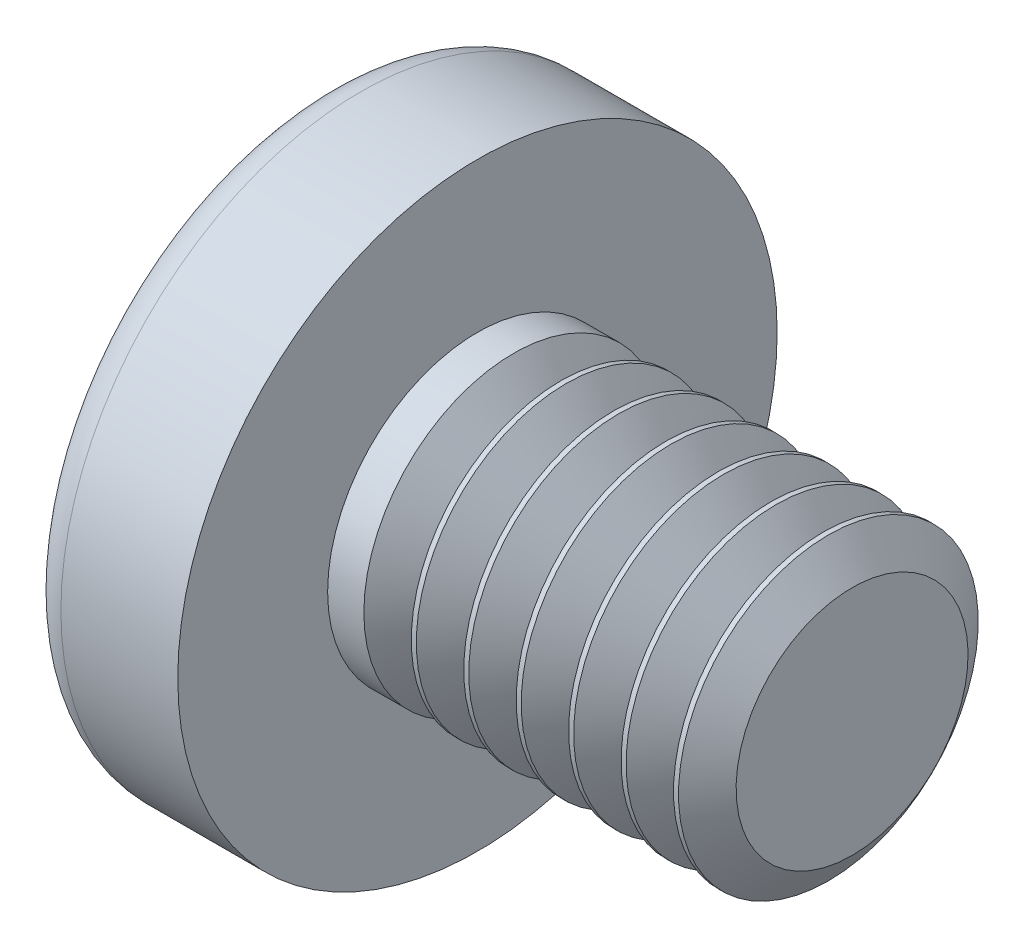
ISO-10303-21;
HEADER;
FILE_DESCRIPTION(('STEP AP214'),'2;1');
FILE_NAME('part.step','',(''),(''),'','','');
FILE_SCHEMA(('AUTOMOTIVE_DESIGN { 1 0 10303 214 1 1 1 1 }'));
ENDSEC;
DATA;
#1=APPLICATION_CONTEXT('core data for automotive mechanical design processes');
#2=APPLICATION_PROTOCOL_DEFINITION('international standard','automotive_design',2000,#1);
#3=PRODUCT_CONTEXT('',#1,'mechanical');
#4=PRODUCT('Part','Part','',(#3));
#5=PRODUCT_RELATED_PRODUCT_CATEGORY('part','',(#4));
#6=PRODUCT_DEFINITION_FORMATION('','',#4);
#7=PRODUCT_DEFINITION_CONTEXT('part definition',#1,'design');
#8=PRODUCT_DEFINITION('design','',#6,#7);
#9=PRODUCT_DEFINITION_SHAPE('','',#8);
#10=(LENGTH_UNIT() NAMED_UNIT(*) SI_UNIT(.MILLI.,.METRE.));
#11=(NAMED_UNIT(*) PLANE_ANGLE_UNIT() SI_UNIT($,.RADIAN.));
#12=(NAMED_UNIT(*) SI_UNIT($,.STERADIAN.) SOLID_ANGLE_UNIT());
#13=UNCERTAINTY_MEASURE_WITH_UNIT(LENGTH_MEASURE(1.E-05),#10,'distance_accuracy_value','');
#14=(GEOMETRIC_REPRESENTATION_CONTEXT(3) GLOBAL_UNCERTAINTY_ASSIGNED_CONTEXT((#13)) GLOBAL_UNIT_ASSIGNED_CONTEXT((#10,
#11,#12)) REPRESENTATION_CONTEXT('',''));
#15=CARTESIAN_POINT('',(0.,0.,0.));
#16=DIRECTION('',(0.,0.,1.));
#17=DIRECTION('',(1.,0.,0.));
#18=AXIS2_PLACEMENT_3D('',#15,#16,#17);
#19=CARTESIAN_POINT('',(3.2,0.,0.));
#20=DIRECTION('',(-1.,0.,0.));
#21=DIRECTION('',(0.,1.,0.));
#22=AXIS2_PLACEMENT_3D('',#19,#20,#21);
#23=SPHERICAL_SURFACE('',#22,3.2);
#24=CARTESIAN_POINT('',(0.627117875780583,0.,0.));
#25=DIRECTION('',(-1.,0.,0.));
#26=DIRECTION('',(0.,0.,1.));
#27=AXIS2_PLACEMENT_3D('',#24,#25,#26);
#28=CIRCLE('',#27,1.9027027027027);
#29=CARTESIAN_POINT('',(0.627117875780583,0.,1.9027027027027));
#30=VERTEX_POINT('',#29);
#31=EDGE_CURVE('E151',#30,#30,#28,.T.);
#32=ORIENTED_EDGE('',*,*,#31,.T.);
#33=EDGE_LOOP('',(#32));
#34=FACE_BOUND('',#33,.T.);
#35=CARTESIAN_POINT('',(3.19174554351625,-0.0818566934638239,0.));
#36=DIRECTION('',(-0.100331502261418,-0.994954064092392,0.));
#37=DIRECTION('',(0.994954064092392,-0.100331502261418,0.));
#38=AXIS2_PLACEMENT_3D('',#35,#36,#37);
#39=CIRCLE('',#38,3.1989422229361);
#40=CARTESIAN_POINT('',(0.118330716626357,0.228067490760364,0.831444314172419));
#41=VERTEX_POINT('',#40);
#42=CARTESIAN_POINT('',(0.0177814447975952,0.238206913129653,0.238206913129654));
#43=VERTEX_POINT('',#42);
#44=EDGE_CURVE('E182',#41,#43,#39,.T.);
#45=ORIENTED_EDGE('',*,*,#44,.F.);
#46=CARTESIAN_POINT('',(2.64043280070581,0.,-0.842892363493775));
#47=DIRECTION('',(0.553083521918191,0.,0.833125811497021));
#48=DIRECTION('',(0.833125811497021,0.,-0.553083521918191));
#49=AXIS2_PLACEMENT_3D('',#46,#47,#48);
#50=CIRCLE('',#49,3.03585523585001);
#51=CARTESIAN_POINT('',(0.118330716626355,-0.22806749076037,0.831444314172418));
#52=VERTEX_POINT('',#51);
#53=EDGE_CURVE('E150',#41,#52,#50,.T.);
#54=ORIENTED_EDGE('',*,*,#53,.T.);
#55=CARTESIAN_POINT('',(3.19174554351625,0.081856693463823,0.));
#56=DIRECTION('',(-0.100331502261417,0.994954064092392,0.));
#57=DIRECTION('',(-0.994954064092392,-0.100331502261417,0.));
#58=AXIS2_PLACEMENT_3D('',#55,#56,#57);
#59=CIRCLE('',#58,3.1989422229361);
#60=CARTESIAN_POINT('',(0.0177814447975943,-0.238206913129655,0.238206913129654));
#61=VERTEX_POINT('',#60);
#62=EDGE_CURVE('E106',#61,#52,#59,.T.);
#63=ORIENTED_EDGE('',*,*,#62,.F.);
#64=CARTESIAN_POINT('',(3.19174554351625,0.,-0.081856693463823));
#65=DIRECTION('',(-0.100331502261417,0.,-0.994954064092392));
#66=DIRECTION('',(-0.994954064092392,0.,0.100331502261417));
#67=AXIS2_PLACEMENT_3D('',#64,#65,#66);
#68=CIRCLE('',#67,3.1989422229361);
#69=CARTESIAN_POINT('',(0.118330716626355,-0.831444314172419,0.228067490760367));
#70=VERTEX_POINT('',#69);
#71=EDGE_CURVE('E131',#70,#61,#68,.T.);
#72=ORIENTED_EDGE('',*,*,#71,.F.);
#73=CARTESIAN_POINT('',(2.64043280070581,0.842892363493772,0.));
#74=DIRECTION('',(0.55308352191819,-0.833125811497022,0.));
#75=DIRECTION('',(0.833125811497022,0.55308352191819,0.));
#76=AXIS2_PLACEMENT_3D('',#73,#74,#75);
#77=CIRCLE('',#76,3.03585523585001);
#78=CARTESIAN_POINT('',(0.118330716626355,-0.831444314172419,-0.228067490760368));
#79=VERTEX_POINT('',#78);
#80=EDGE_CURVE('E139',#70,#79,#77,.T.);
#81=ORIENTED_EDGE('',*,*,#80,.T.);
#82=CARTESIAN_POINT('',(3.19174554351625,0.,0.0818566934638239));
#83=DIRECTION('',(-0.100331502261418,0.,0.994954064092392));
#84=DIRECTION('',(0.994954064092392,0.,0.100331502261418));
#85=AXIS2_PLACEMENT_3D('',#82,#83,#84);
#86=CIRCLE('',#85,3.1989422229361);
#87=CARTESIAN_POINT('',(0.0177814447975943,-0.238206913129653,-0.238206913129654));
#88=VERTEX_POINT('',#87);
#89=EDGE_CURVE('E49',#88,#79,#86,.T.);
#90=ORIENTED_EDGE('',*,*,#89,.F.);
#91=CARTESIAN_POINT('',(0.118330716626356,-0.228067490760364,-0.831444314172419));
#92=VERTEX_POINT('',#91);
#93=EDGE_CURVE('E189',#92,#88,#59,.T.);
#94=ORIENTED_EDGE('',*,*,#93,.F.);
#95=CARTESIAN_POINT('',(2.64043280070581,0.,0.842892363493774));
#96=DIRECTION('',(0.55308352191819,0.,-0.833125811497022));
#97=DIRECTION('',(-0.833125811497022,0.,-0.55308352191819));
#98=AXIS2_PLACEMENT_3D('',#95,#96,#97);
#99=CIRCLE('',#98,3.03585523585001);
#100=CARTESIAN_POINT('',(0.118330716626357,0.22806749076037,-0.831444314172417));
#101=VERTEX_POINT('',#100);
#102=EDGE_CURVE('E132',#92,#101,#99,.T.);
#103=ORIENTED_EDGE('',*,*,#102,.T.);
#104=CARTESIAN_POINT('',(0.0177814447975956,0.238206913129655,-0.238206913129654));
#105=VERTEX_POINT('',#104);
#106=EDGE_CURVE('E177',#105,#101,#39,.T.);
#107=ORIENTED_EDGE('',*,*,#106,.F.);
#108=CARTESIAN_POINT('',(0.118330716626357,0.831444314172418,-0.228067490760367));
#109=VERTEX_POINT('',#108);
#110=EDGE_CURVE('E42',#109,#105,#86,.T.);
#111=ORIENTED_EDGE('',*,*,#110,.F.);
#112=CARTESIAN_POINT('',(2.64043280070582,-0.842892363493777,0.));
#113=DIRECTION('',(0.553083521918191,0.833125811497021,0.));
#114=DIRECTION('',(-0.833125811497021,0.553083521918191,0.));
#115=AXIS2_PLACEMENT_3D('',#112,#113,#114);
#116=CIRCLE('',#115,3.03585523585001);
#117=CARTESIAN_POINT('',(0.118330716626358,0.831444314172418,0.228067490760367));
#118=VERTEX_POINT('',#117);
#119=EDGE_CURVE('E11',#109,#118,#116,.T.);
#120=ORIENTED_EDGE('',*,*,#119,.T.);
#121=EDGE_CURVE('E165',#43,#118,#68,.T.);
#122=ORIENTED_EDGE('',*,*,#121,.F.);
#123=EDGE_LOOP('',(#45,#54,#63,#72,#81,#90,#94,#103,#107,#111,#120,#122));
#124=FACE_BOUND('',#123,.T.);
#125=ADVANCED_FACE('F34',(#34,#124),#23,.T.);
#126=CARTESIAN_POINT('',(1.37075949367089,0.,-0.101772151898734));
#127=DIRECTION('',(-0.100331502261418,0.,0.994954064092392));
#128=DIRECTION('',(0.994954064092392,0.,0.100331502261418));
#129=AXIS2_PLACEMENT_3D('',#126,#127,#128);
#130=PLANE('',#129);
#131=ORIENTED_EDGE('',*,*,#110,.T.);
#132=DIRECTION('',(0.989983749746913,-0.0998302940921261,0.0998302940921257));
#133=VECTOR('',#132,1.);
#134=CARTESIAN_POINT('',(1.38081767298512,0.100757881715786,-0.100757881715786));
#135=LINE('',#134,#133);
#136=CARTESIAN_POINT('',(1.19,0.12,-0.12));
#137=VERTEX_POINT('',#136);
#138=EDGE_CURVE('E171',#105,#137,#135,.T.);
#139=ORIENTED_EDGE('',*,*,#138,.T.);
#140=DIRECTION('',(0.830201128729582,-0.551141925795269,0.083717760880294));
#141=VECTOR('',#140,1.);
#142=CARTESIAN_POINT('',(0.,0.91,-0.24));
#143=LINE('',#142,#141);
#144=EDGE_CURVE('E155',#109,#137,#143,.T.);
#145=ORIENTED_EDGE('',*,*,#144,.F.);
#146=EDGE_LOOP('',(#131,#139,#145));
#147=FACE_BOUND('',#146,.T.);
#148=ADVANCED_FACE('F170',(#147),#130,.T.);
#149=DIRECTION('',(0.830201128729583,0.551141925795268,0.0837177608802941));
#150=VECTOR('',#149,1.);
#151=CARTESIAN_POINT('',(0.,-0.909999999999998,-0.24));
#152=LINE('',#151,#150);
#153=CARTESIAN_POINT('',(1.19,-0.12,-0.12));
#154=VERTEX_POINT('',#153);
#155=EDGE_CURVE('E140',#79,#154,#152,.T.);
#156=ORIENTED_EDGE('',*,*,#155,.T.);
#157=DIRECTION('',(-0.989983749746913,-0.0998302940921249,-0.0998302940921257));
#158=VECTOR('',#157,1.);
#159=CARTESIAN_POINT('',(1.38081767298512,-0.100757881715786,-0.100757881715786));
#160=LINE('',#159,#158);
#161=EDGE_CURVE('E192',#154,#88,#160,.T.);
#162=ORIENTED_EDGE('',*,*,#161,.T.);
#163=ORIENTED_EDGE('',*,*,#89,.T.);
#164=EDGE_LOOP('',(#156,#162,#163));
#165=FACE_BOUND('',#164,.T.);
#166=ADVANCED_FACE('F280',(#165),#130,.T.);
#167=CARTESIAN_POINT('',(1.37075949367089,0.,0.101772151898734));
#168=DIRECTION('',(-0.100331502261417,0.,-0.994954064092392));
#169=DIRECTION('',(-0.994954064092392,0.,0.100331502261417));
#170=AXIS2_PLACEMENT_3D('',#167,#168,#169);
#171=PLANE('',#170);
#172=DIRECTION('',(0.830201128729582,-0.551141925795269,-0.0837177608802937));
#173=VECTOR('',#172,1.);
#174=CARTESIAN_POINT('',(0.,0.91,0.239999999999999));
#175=LINE('',#174,#173);
#176=CARTESIAN_POINT('',(1.19,0.12,0.12));
#177=VERTEX_POINT('',#176);
#178=EDGE_CURVE('E633',#118,#177,#175,.T.);
#179=ORIENTED_EDGE('',*,*,#178,.T.);
#180=DIRECTION('',(-0.989983749746913,0.0998302940921254,0.0998302940921253));
#181=VECTOR('',#180,1.);
#182=CARTESIAN_POINT('',(1.38081767298512,0.100757881715786,0.100757881715786));
#183=LINE('',#182,#181);
#184=EDGE_CURVE('E186',#177,#43,#183,.T.);
#185=ORIENTED_EDGE('',*,*,#184,.T.);
#186=ORIENTED_EDGE('',*,*,#121,.T.);
#187=EDGE_LOOP('',(#179,#185,#186));
#188=FACE_BOUND('',#187,.T.);
#189=ADVANCED_FACE('F310',(#188),#171,.T.);
#190=ORIENTED_EDGE('',*,*,#71,.T.);
#191=DIRECTION('',(0.989983749746913,0.0998302940921256,-0.0998302940921253));
#192=VECTOR('',#191,1.);
#193=CARTESIAN_POINT('',(1.38081767298512,-0.100757881715786,0.100757881715786));
#194=LINE('',#193,#192);
#195=CARTESIAN_POINT('',(1.19,-0.12,0.12));
#196=VERTEX_POINT('',#195);
#197=EDGE_CURVE('E104',#61,#196,#194,.T.);
#198=ORIENTED_EDGE('',*,*,#197,.T.);
#199=DIRECTION('',(0.830201128729583,0.551141925795268,-0.0837177608802937));
#200=VECTOR('',#199,1.);
#201=CARTESIAN_POINT('',(0.,-0.909999999999998,0.239999999999999));
#202=LINE('',#201,#200);
#203=EDGE_CURVE('E129',#70,#196,#202,.T.);
#204=ORIENTED_EDGE('',*,*,#203,.F.);
#205=EDGE_LOOP('',(#190,#198,#204));
#206=FACE_BOUND('',#205,.T.);
#207=ADVANCED_FACE('F128',(#206),#171,.T.);
#208=CARTESIAN_POINT('',(-25.4,0.,0.));
#209=DIRECTION('',(-1.,0.,0.));
#210=DIRECTION('',(0.,0.,1.));
#211=AXIS2_PLACEMENT_3D('',#208,#209,#210);
#212=CYLINDRICAL_SURFACE('',#211,1.);
#213=CARTESIAN_POINT('',(1.84175309636461,0.,0.));
#214=DIRECTION('',(-1.,0.,0.));
#215=DIRECTION('',(0.,-1.,0.));
#216=AXIS2_PLACEMENT_3D('',#213,#214,#215);
#217=CIRCLE('',#216,1.);
#218=CARTESIAN_POINT('',(1.84175309636461,-0.999999999999999,0.));
#219=VERTEX_POINT('',#218);
#220=EDGE_CURVE('E204',#219,#219,#217,.T.);
#221=ORIENTED_EDGE('',*,*,#220,.T.);
#222=EDGE_LOOP('',(#221));
#223=FACE_BOUND('',#222,.T.);
#224=CARTESIAN_POINT('',(1.6,0.,0.));
#225=DIRECTION('',(-1.,0.,0.));
#226=DIRECTION('',(0.,0.,1.));
#227=AXIS2_PLACEMENT_3D('',#224,#225,#226);
#228=CIRCLE('',#227,1.);
#229=CARTESIAN_POINT('',(1.6,0.,1.));
#230=VERTEX_POINT('',#229);
#231=EDGE_CURVE('E161',#230,#230,#228,.T.);
#232=ORIENTED_EDGE('',*,*,#231,.F.);
#233=EDGE_LOOP('',(#232));
#234=FACE_BOUND('',#233,.T.);
#235=ADVANCED_FACE('F36',(#223,#234),#212,.T.);
#236=CARTESIAN_POINT('',(1.6,1.,0.));
#237=DIRECTION('',(-1.,0.,0.));
#238=DIRECTION('',(0.,0.,1.));
#239=AXIS2_PLACEMENT_3D('',#236,#237,#238);
#240=PLANE('',#239);
#241=CARTESIAN_POINT('',(1.6,0.,0.));
#242=DIRECTION('',(-1.,0.,0.));
#243=DIRECTION('',(0.,0.,1.));
#244=AXIS2_PLACEMENT_3D('',#241,#242,#243);
#245=CIRCLE('',#244,2.);
#246=CARTESIAN_POINT('',(1.6,0.,2.));
#247=VERTEX_POINT('',#246);
#248=EDGE_CURVE('E158',#247,#247,#245,.T.);
#249=ORIENTED_EDGE('',*,*,#248,.F.);
#250=EDGE_LOOP('',(#249));
#251=FACE_BOUND('',#250,.T.);
#252=ORIENTED_EDGE('',*,*,#231,.T.);
#253=EDGE_LOOP('',(#252));
#254=FACE_BOUND('',#253,.T.);
#255=ADVANCED_FACE('F290',(#251,#254),#240,.F.);
#256=CARTESIAN_POINT('',(-25.4,0.,0.));
#257=DIRECTION('',(-1.,0.,0.));
#258=DIRECTION('',(0.,0.,1.));
#259=AXIS2_PLACEMENT_3D('',#256,#257,#258);
#260=CYLINDRICAL_SURFACE('',#259,2.);
#261=ORIENTED_EDGE('',*,*,#248,.T.);
#262=EDGE_LOOP('',(#261));
#263=FACE_BOUND('',#262,.T.);
#264=CARTESIAN_POINT('',(0.820084035097042,0.,0.));
#265=DIRECTION('',(-1.,0.,0.));
#266=DIRECTION('',(0.,0.,1.));
#267=AXIS2_PLACEMENT_3D('',#264,#265,#266);
#268=CIRCLE('',#267,2.);
#269=CARTESIAN_POINT('',(0.820084035097042,0.,2.));
#270=VERTEX_POINT('',#269);
#271=EDGE_CURVE('E154',#270,#270,#268,.T.);
#272=ORIENTED_EDGE('',*,*,#271,.F.);
#273=EDGE_LOOP('',(#272));
#274=FACE_BOUND('',#273,.T.);
#275=ADVANCED_FACE('F287',(#263,#274),#260,.T.);
#276=CARTESIAN_POINT('',(0.820084035097042,0.,0.));
#277=DIRECTION('',(-1.,0.,0.));
#278=DIRECTION('',(0.,0.,1.));
#279=AXIS2_PLACEMENT_3D('',#276,#277,#278);
#280=TOROIDAL_SURFACE('',#279,1.76,0.24);
#281=ORIENTED_EDGE('',*,*,#271,.T.);
#282=EDGE_LOOP('',(#281));
#283=FACE_BOUND('',#282,.T.);
#284=ORIENTED_EDGE('',*,*,#31,.F.);
#285=EDGE_LOOP('',(#284));
#286=FACE_BOUND('',#285,.T.);
#287=ADVANCED_FACE('F283',(#283,#286),#280,.T.);
#288=CARTESIAN_POINT('',(1.19,0.12,0.12));
#289=DIRECTION('',(0.553083521918191,0.833125811497021,0.));
#290=DIRECTION('',(-0.833125811497021,0.553083521918191,0.));
#291=AXIS2_PLACEMENT_3D('',#288,#289,#290);
#292=PLANE('',#291);
#293=ORIENTED_EDGE('',*,*,#144,.T.);
#294=DIRECTION('',(0.,0.,-1.));
#295=VECTOR('',#294,1.);
#296=CARTESIAN_POINT('',(1.19,0.12,0.12));
#297=LINE('',#296,#295);
#298=EDGE_CURVE('E122',#177,#137,#297,.T.);
#299=ORIENTED_EDGE('',*,*,#298,.F.);
#300=ORIENTED_EDGE('',*,*,#178,.F.);
#301=ORIENTED_EDGE('',*,*,#119,.F.);
#302=EDGE_LOOP('',(#293,#299,#300,#301));
#303=FACE_BOUND('',#302,.T.);
#304=ADVANCED_FACE('F286',(#303),#292,.F.);
#305=CARTESIAN_POINT('',(0.,-0.909999999999998,-0.24));
#306=DIRECTION('',(0.55308352191819,-0.833125811497022,0.));
#307=DIRECTION('',(0.833125811497022,0.55308352191819,0.));
#308=AXIS2_PLACEMENT_3D('',#305,#306,#307);
#309=PLANE('',#308);
#310=ORIENTED_EDGE('',*,*,#203,.T.);
#311=DIRECTION('',(0.,0.,1.));
#312=VECTOR('',#311,1.);
#313=CARTESIAN_POINT('',(1.19,-0.12,-0.12));
#314=LINE('',#313,#312);
#315=EDGE_CURVE('E121',#154,#196,#314,.T.);
#316=ORIENTED_EDGE('',*,*,#315,.F.);
#317=ORIENTED_EDGE('',*,*,#155,.F.);
#318=ORIENTED_EDGE('',*,*,#80,.F.);
#319=EDGE_LOOP('',(#310,#316,#317,#318));
#320=FACE_BOUND('',#319,.T.);
#321=ADVANCED_FACE('F136',(#320),#309,.F.);
#322=CARTESIAN_POINT('',(1.19,0.12,-0.12));
#323=DIRECTION('',(-1.,0.,0.));
#324=DIRECTION('',(0.,0.,1.));
#325=AXIS2_PLACEMENT_3D('',#322,#323,#324);
#326=PLANE('',#325);
#327=DIRECTION('',(0.,1.,0.));
#328=VECTOR('',#327,1.);
#329=CARTESIAN_POINT('',(1.19,-0.12,-0.12));
#330=LINE('',#329,#328);
#331=EDGE_CURVE('E144',#154,#137,#330,.T.);
#332=ORIENTED_EDGE('',*,*,#331,.F.);
#333=ORIENTED_EDGE('',*,*,#315,.T.);
#334=DIRECTION('',(0.,-1.,0.));
#335=VECTOR('',#334,1.);
#336=CARTESIAN_POINT('',(1.19,0.12,0.12));
#337=LINE('',#336,#335);
#338=EDGE_CURVE('E113',#177,#196,#337,.T.);
#339=ORIENTED_EDGE('',*,*,#338,.F.);
#340=ORIENTED_EDGE('',*,*,#298,.T.);
#341=EDGE_LOOP('',(#332,#333,#339,#340));
#342=FACE_BOUND('',#341,.T.);
#343=ADVANCED_FACE('F142',(#342),#326,.T.);
#344=CARTESIAN_POINT('',(0.,0.240000000000003,-0.909999999999998));
#345=DIRECTION('',(0.55308352191819,0.,-0.833125811497022));
#346=DIRECTION('',(0.833125811497022,0.,0.55308352191819));
#347=AXIS2_PLACEMENT_3D('',#344,#345,#346);
#348=PLANE('',#347);
#349=DIRECTION('',(0.830201128729583,0.0837177608802917,0.551141925795268));
#350=VECTOR('',#349,1.);
#351=CARTESIAN_POINT('',(0.,-0.239999999999996,-0.909999999999999));
#352=LINE('',#351,#350);
#353=EDGE_CURVE('E197',#92,#154,#352,.T.);
#354=ORIENTED_EDGE('',*,*,#353,.T.);
#355=ORIENTED_EDGE('',*,*,#331,.T.);
#356=DIRECTION('',(0.830201128729583,-0.083717760880296,0.551141925795268));
#357=VECTOR('',#356,1.);
#358=CARTESIAN_POINT('',(0.,0.240000000000003,-0.909999999999998));
#359=LINE('',#358,#357);
#360=EDGE_CURVE('E110',#101,#137,#359,.T.);
#361=ORIENTED_EDGE('',*,*,#360,.F.);
#362=ORIENTED_EDGE('',*,*,#102,.F.);
#363=EDGE_LOOP('',(#354,#355,#361,#362));
#364=FACE_BOUND('',#363,.T.);
#365=ADVANCED_FACE('F411',(#364),#348,.F.);
#366=CARTESIAN_POINT('',(1.37075949367089,-0.101772151898734,0.));
#367=DIRECTION('',(-0.100331502261417,0.994954064092392,0.));
#368=DIRECTION('',(-0.994954064092392,-0.100331502261417,0.));
#369=AXIS2_PLACEMENT_3D('',#366,#367,#368);
#370=PLANE('',#369);
#371=ORIENTED_EDGE('',*,*,#93,.T.);
#372=ORIENTED_EDGE('',*,*,#161,.F.);
#373=ORIENTED_EDGE('',*,*,#353,.F.);
#374=EDGE_LOOP('',(#371,#372,#373));
#375=FACE_BOUND('',#374,.T.);
#376=ADVANCED_FACE('F408',(#375),#370,.T.);
#377=CARTESIAN_POINT('',(1.37075949367089,0.101772151898734,0.));
#378=DIRECTION('',(-0.100331502261418,-0.994954064092392,0.));
#379=DIRECTION('',(0.994954064092392,-0.100331502261418,0.));
#380=AXIS2_PLACEMENT_3D('',#377,#378,#379);
#381=PLANE('',#380);
#382=ORIENTED_EDGE('',*,*,#106,.T.);
#383=ORIENTED_EDGE('',*,*,#360,.T.);
#384=ORIENTED_EDGE('',*,*,#138,.F.);
#385=EDGE_LOOP('',(#382,#383,#384));
#386=FACE_BOUND('',#385,.T.);
#387=ADVANCED_FACE('F405',(#386),#381,.T.);
#388=CARTESIAN_POINT('',(1.19,-0.12,0.12));
#389=DIRECTION('',(0.553083521918191,0.,0.833125811497021));
#390=DIRECTION('',(-0.833125811497021,0.,0.553083521918191));
#391=AXIS2_PLACEMENT_3D('',#388,#389,#390);
#392=PLANE('',#391);
#393=DIRECTION('',(0.830201128729582,-0.0837177608802921,-0.551141925795269));
#394=VECTOR('',#393,1.);
#395=CARTESIAN_POINT('',(0.,0.239999999999997,0.910000000000001));
#396=LINE('',#395,#394);
#397=EDGE_CURVE('E109',#41,#177,#396,.T.);
#398=ORIENTED_EDGE('',*,*,#397,.T.);
#399=ORIENTED_EDGE('',*,*,#338,.T.);
#400=DIRECTION('',(0.830201128729582,0.0837177608802956,-0.551141925795269));
#401=VECTOR('',#400,1.);
#402=CARTESIAN_POINT('',(0.,-0.240000000000003,0.909999999999999));
#403=LINE('',#402,#401);
#404=EDGE_CURVE('E100',#52,#196,#403,.T.);
#405=ORIENTED_EDGE('',*,*,#404,.F.);
#406=ORIENTED_EDGE('',*,*,#53,.F.);
#407=EDGE_LOOP('',(#398,#399,#405,#406));
#408=FACE_BOUND('',#407,.T.);
#409=ADVANCED_FACE('F114',(#408),#392,.F.);
#410=ORIENTED_EDGE('',*,*,#44,.T.);
#411=ORIENTED_EDGE('',*,*,#184,.F.);
#412=ORIENTED_EDGE('',*,*,#397,.F.);
#413=EDGE_LOOP('',(#410,#411,#412));
#414=FACE_BOUND('',#413,.T.);
#415=ADVANCED_FACE('F404',(#414),#381,.T.);
#416=ORIENTED_EDGE('',*,*,#62,.T.);
#417=ORIENTED_EDGE('',*,*,#404,.T.);
#418=ORIENTED_EDGE('',*,*,#197,.F.);
#419=EDGE_LOOP('',(#416,#417,#418));
#420=FACE_BOUND('',#419,.T.);
#421=ADVANCED_FACE('F102',(#420),#370,.T.);
#422=CARTESIAN_POINT('',(2.1582469036354,0.,0.));
#423=DIRECTION('',(1.,0.,0.));
#424=DIRECTION('',(0.,1.,0.));
#425=AXIS2_PLACEMENT_3D('',#422,#423,#424);
#426=CONICAL_SURFACE('',#425,1.,0.959931088596877);
#427=CARTESIAN_POINT('',(2.,0.,0.));
#428=DIRECTION('',(-1.,0.,0.));
#429=DIRECTION('',(0.,-1.,0.));
#430=AXIS2_PLACEMENT_3D('',#427,#428,#429);
#431=CIRCLE('',#430,0.774000000000001);
#432=CARTESIAN_POINT('',(2.,-0.774,0.));
#433=VERTEX_POINT('',#432);
#434=EDGE_CURVE('E207',#433,#433,#431,.T.);
#435=ORIENTED_EDGE('',*,*,#434,.F.);
#436=EDGE_LOOP('',(#435));
#437=FACE_BOUND('',#436,.T.);
#438=CARTESIAN_POINT('',(2.1582469036354,0.,0.));
#439=DIRECTION('',(-1.,0.,0.));
#440=DIRECTION('',(0.,-1.,0.));
#441=AXIS2_PLACEMENT_3D('',#438,#439,#440);
#442=CIRCLE('',#441,1.);
#443=CARTESIAN_POINT('',(2.1582469036354,-1.,0.));
#444=VERTEX_POINT('',#443);
#445=EDGE_CURVE('E199',#444,#444,#442,.T.);
#446=ORIENTED_EDGE('',*,*,#445,.T.);
#447=EDGE_LOOP('',(#446));
#448=FACE_BOUND('',#447,.T.);
#449=ADVANCED_FACE('F328',(#437,#448),#426,.T.);
#450=CARTESIAN_POINT('',(2.,0.,0.));
#451=DIRECTION('',(-1.,0.,0.));
#452=DIRECTION('',(0.,-1.,0.));
#453=AXIS2_PLACEMENT_3D('',#450,#451,#452);
#454=CONICAL_SURFACE('',#453,0.774000000000001,0.959931088596878);
#455=ORIENTED_EDGE('',*,*,#220,.F.);
#456=EDGE_LOOP('',(#455));
#457=FACE_BOUND('',#456,.T.);
#458=ORIENTED_EDGE('',*,*,#434,.T.);
#459=EDGE_LOOP('',(#458));
#460=FACE_BOUND('',#459,.T.);
#461=ADVANCED_FACE('F318',(#457,#460),#454,.T.);
#462=CARTESIAN_POINT('',(2.19175309636461,0.,0.));
#463=DIRECTION('',(-1.,0.,0.));
#464=DIRECTION('',(0.,-1.,0.));
#465=AXIS2_PLACEMENT_3D('',#462,#463,#464);
#466=CIRCLE('',#465,1.);
#467=CARTESIAN_POINT('',(2.19175309636461,-0.999999999999999,0.));
#468=VERTEX_POINT('',#467);
#469=EDGE_CURVE('E213',#468,#468,#466,.T.);
#470=ORIENTED_EDGE('',*,*,#469,.T.);
#471=EDGE_LOOP('',(#470));
#472=FACE_BOUND('',#471,.T.);
#473=ORIENTED_EDGE('',*,*,#445,.F.);
#474=EDGE_LOOP('',(#473));
#475=FACE_BOUND('',#474,.T.);
#476=ADVANCED_FACE('F298',(#472,#475),#212,.T.);
#477=CARTESIAN_POINT('',(2.5082469036354,0.,0.));
#478=DIRECTION('',(1.,0.,0.));
#479=DIRECTION('',(0.,1.,0.));
#480=AXIS2_PLACEMENT_3D('',#477,#478,#479);
#481=CONICAL_SURFACE('',#480,1.,0.959931088596877);
#482=CARTESIAN_POINT('',(2.35,0.,0.));
#483=DIRECTION('',(-1.,0.,0.));
#484=DIRECTION('',(0.,-1.,0.));
#485=AXIS2_PLACEMENT_3D('',#482,#483,#484);
#486=CIRCLE('',#485,0.774000000000001);
#487=CARTESIAN_POINT('',(2.35,-0.774,0.));
#488=VERTEX_POINT('',#487);
#489=EDGE_CURVE('E216',#488,#488,#486,.T.);
#490=ORIENTED_EDGE('',*,*,#489,.F.);
#491=EDGE_LOOP('',(#490));
#492=FACE_BOUND('',#491,.T.);
#493=CARTESIAN_POINT('',(2.5082469036354,0.,0.));
#494=DIRECTION('',(-1.,0.,0.));
#495=DIRECTION('',(0.,-1.,0.));
#496=AXIS2_PLACEMENT_3D('',#493,#494,#495);
#497=CIRCLE('',#496,1.);
#498=CARTESIAN_POINT('',(2.5082469036354,-1.,0.));
#499=VERTEX_POINT('',#498);
#500=EDGE_CURVE('E210',#499,#499,#497,.T.);
#501=ORIENTED_EDGE('',*,*,#500,.T.);
#502=EDGE_LOOP('',(#501));
#503=FACE_BOUND('',#502,.T.);
#504=ADVANCED_FACE('F317',(#492,#503),#481,.T.);
#505=CARTESIAN_POINT('',(2.35,0.,0.));
#506=DIRECTION('',(-1.,0.,0.));
#507=DIRECTION('',(0.,-1.,0.));
#508=AXIS2_PLACEMENT_3D('',#505,#506,#507);
#509=CONICAL_SURFACE('',#508,0.774000000000001,0.959931088596878);
#510=ORIENTED_EDGE('',*,*,#469,.F.);
#511=EDGE_LOOP('',(#510));
#512=FACE_BOUND('',#511,.T.);
#513=ORIENTED_EDGE('',*,*,#489,.T.);
#514=EDGE_LOOP('',(#513));
#515=FACE_BOUND('',#514,.T.);
#516=ADVANCED_FACE('F325',(#512,#515),#509,.T.);
#517=CARTESIAN_POINT('',(2.54175309636461,0.,0.));
#518=DIRECTION('',(-1.,0.,0.));
#519=DIRECTION('',(0.,-1.,0.));
#520=AXIS2_PLACEMENT_3D('',#517,#518,#519);
#521=CIRCLE('',#520,1.);
#522=CARTESIAN_POINT('',(2.54175309636461,-0.999999999999999,0.));
#523=VERTEX_POINT('',#522);
#524=EDGE_CURVE('E222',#523,#523,#521,.T.);
#525=ORIENTED_EDGE('',*,*,#524,.T.);
#526=EDGE_LOOP('',(#525));
#527=FACE_BOUND('',#526,.T.);
#528=ORIENTED_EDGE('',*,*,#500,.F.);
#529=EDGE_LOOP('',(#528));
#530=FACE_BOUND('',#529,.T.);
#531=ADVANCED_FACE('F320',(#527,#530),#212,.T.);
#532=CARTESIAN_POINT('',(2.8582469036354,0.,0.));
#533=DIRECTION('',(1.,0.,0.));
#534=DIRECTION('',(0.,1.,0.));
#535=AXIS2_PLACEMENT_3D('',#532,#533,#534);
#536=CONICAL_SURFACE('',#535,1.,0.959931088596877);
#537=CARTESIAN_POINT('',(2.7,0.,0.));
#538=DIRECTION('',(-1.,0.,0.));
#539=DIRECTION('',(0.,-1.,0.));
#540=AXIS2_PLACEMENT_3D('',#537,#538,#539);
#541=CIRCLE('',#540,0.774000000000001);
#542=CARTESIAN_POINT('',(2.7,-0.774,0.));
#543=VERTEX_POINT('',#542);
#544=EDGE_CURVE('E225',#543,#543,#541,.T.);
#545=ORIENTED_EDGE('',*,*,#544,.F.);
#546=EDGE_LOOP('',(#545));
#547=FACE_BOUND('',#546,.T.);
#548=CARTESIAN_POINT('',(2.8582469036354,0.,0.));
#549=DIRECTION('',(-1.,0.,0.));
#550=DIRECTION('',(0.,-1.,0.));
#551=AXIS2_PLACEMENT_3D('',#548,#549,#550);
#552=CIRCLE('',#551,1.);
#553=CARTESIAN_POINT('',(2.8582469036354,-1.,0.));
#554=VERTEX_POINT('',#553);
#555=EDGE_CURVE('E219',#554,#554,#552,.T.);
#556=ORIENTED_EDGE('',*,*,#555,.T.);
#557=EDGE_LOOP('',(#556));
#558=FACE_BOUND('',#557,.T.);
#559=ADVANCED_FACE('F333',(#547,#558),#536,.T.);
#560=CARTESIAN_POINT('',(2.7,0.,0.));
#561=DIRECTION('',(-1.,0.,0.));
#562=DIRECTION('',(0.,-1.,0.));
#563=AXIS2_PLACEMENT_3D('',#560,#561,#562);
#564=CONICAL_SURFACE('',#563,0.774000000000001,0.959931088596878);
#565=ORIENTED_EDGE('',*,*,#524,.F.);
#566=EDGE_LOOP('',(#565));
#567=FACE_BOUND('',#566,.T.);
#568=ORIENTED_EDGE('',*,*,#544,.T.);
#569=EDGE_LOOP('',(#568));
#570=FACE_BOUND('',#569,.T.);
#571=ADVANCED_FACE('F340',(#567,#570),#564,.T.);
#572=CARTESIAN_POINT('',(2.89175309636461,0.,0.));
#573=DIRECTION('',(-1.,0.,0.));
#574=DIRECTION('',(0.,-1.,0.));
#575=AXIS2_PLACEMENT_3D('',#572,#573,#574);
#576=CIRCLE('',#575,1.);
#577=CARTESIAN_POINT('',(2.89175309636461,-0.999999999999999,0.));
#578=VERTEX_POINT('',#577);
#579=EDGE_CURVE('E231',#578,#578,#576,.T.);
#580=ORIENTED_EDGE('',*,*,#579,.T.);
#581=EDGE_LOOP('',(#580));
#582=FACE_BOUND('',#581,.T.);
#583=ORIENTED_EDGE('',*,*,#555,.F.);
#584=EDGE_LOOP('',(#583));
#585=FACE_BOUND('',#584,.T.);
#586=ADVANCED_FACE('F335',(#582,#585),#212,.T.);
#587=CARTESIAN_POINT('',(3.2082469036354,0.,0.));
#588=DIRECTION('',(1.,0.,0.));
#589=DIRECTION('',(0.,1.,0.));
#590=AXIS2_PLACEMENT_3D('',#587,#588,#589);
#591=CONICAL_SURFACE('',#590,1.,0.959931088596877);
#592=CARTESIAN_POINT('',(3.05,0.,0.));
#593=DIRECTION('',(-1.,0.,0.));
#594=DIRECTION('',(0.,-1.,0.));
#595=AXIS2_PLACEMENT_3D('',#592,#593,#594);
#596=CIRCLE('',#595,0.774000000000001);
#597=CARTESIAN_POINT('',(3.05,-0.774,0.));
#598=VERTEX_POINT('',#597);
#599=EDGE_CURVE('E234',#598,#598,#596,.T.);
#600=ORIENTED_EDGE('',*,*,#599,.F.);
#601=EDGE_LOOP('',(#600));
#602=FACE_BOUND('',#601,.T.);
#603=CARTESIAN_POINT('',(3.2082469036354,0.,0.));
#604=DIRECTION('',(-1.,0.,0.));
#605=DIRECTION('',(0.,-1.,0.));
#606=AXIS2_PLACEMENT_3D('',#603,#604,#605);
#607=CIRCLE('',#606,1.);
#608=CARTESIAN_POINT('',(3.2082469036354,-1.,0.));
#609=VERTEX_POINT('',#608);
#610=EDGE_CURVE('E228',#609,#609,#607,.T.);
#611=ORIENTED_EDGE('',*,*,#610,.T.);
#612=EDGE_LOOP('',(#611));
#613=FACE_BOUND('',#612,.T.);
#614=ADVANCED_FACE('F347',(#602,#613),#591,.T.);
#615=CARTESIAN_POINT('',(3.05,0.,0.));
#616=DIRECTION('',(-1.,0.,0.));
#617=DIRECTION('',(0.,-1.,0.));
#618=AXIS2_PLACEMENT_3D('',#615,#616,#617);
#619=CONICAL_SURFACE('',#618,0.774000000000001,0.959931088596878);
#620=ORIENTED_EDGE('',*,*,#579,.F.);
#621=EDGE_LOOP('',(#620));
#622=FACE_BOUND('',#621,.T.);
#623=ORIENTED_EDGE('',*,*,#599,.T.);
#624=EDGE_LOOP('',(#623));
#625=FACE_BOUND('',#624,.T.);
#626=ADVANCED_FACE('F354',(#622,#625),#619,.T.);
#627=CARTESIAN_POINT('',(3.24175309636461,0.,0.));
#628=DIRECTION('',(-1.,0.,0.));
#629=DIRECTION('',(0.,-1.,0.));
#630=AXIS2_PLACEMENT_3D('',#627,#628,#629);
#631=CIRCLE('',#630,1.);
#632=CARTESIAN_POINT('',(3.24175309636461,-0.999999999999999,0.));
#633=VERTEX_POINT('',#632);
#634=EDGE_CURVE('E240',#633,#633,#631,.T.);
#635=ORIENTED_EDGE('',*,*,#634,.T.);
#636=EDGE_LOOP('',(#635));
#637=FACE_BOUND('',#636,.T.);
#638=ORIENTED_EDGE('',*,*,#610,.F.);
#639=EDGE_LOOP('',(#638));
#640=FACE_BOUND('',#639,.T.);
#641=ADVANCED_FACE('F349',(#637,#640),#212,.T.);
#642=CARTESIAN_POINT('',(3.5582469036354,0.,0.));
#643=DIRECTION('',(1.,0.,0.));
#644=DIRECTION('',(0.,1.,0.));
#645=AXIS2_PLACEMENT_3D('',#642,#643,#644);
#646=CONICAL_SURFACE('',#645,1.,0.959931088596877);
#647=CARTESIAN_POINT('',(3.4,0.,0.));
#648=DIRECTION('',(-1.,0.,0.));
#649=DIRECTION('',(0.,-1.,0.));
#650=AXIS2_PLACEMENT_3D('',#647,#648,#649);
#651=CIRCLE('',#650,0.774000000000001);
#652=CARTESIAN_POINT('',(3.4,-0.774,0.));
#653=VERTEX_POINT('',#652);
#654=EDGE_CURVE('E243',#653,#653,#651,.T.);
#655=ORIENTED_EDGE('',*,*,#654,.F.);
#656=EDGE_LOOP('',(#655));
#657=FACE_BOUND('',#656,.T.);
#658=CARTESIAN_POINT('',(3.5582469036354,0.,0.));
#659=DIRECTION('',(-1.,0.,0.));
#660=DIRECTION('',(0.,-1.,0.));
#661=AXIS2_PLACEMENT_3D('',#658,#659,#660);
#662=CIRCLE('',#661,1.);
#663=CARTESIAN_POINT('',(3.5582469036354,-1.,0.));
#664=VERTEX_POINT('',#663);
#665=EDGE_CURVE('E237',#664,#664,#662,.T.);
#666=ORIENTED_EDGE('',*,*,#665,.T.);
#667=EDGE_LOOP('',(#666));
#668=FACE_BOUND('',#667,.T.);
#669=ADVANCED_FACE('F361',(#657,#668),#646,.T.);
#670=CARTESIAN_POINT('',(3.4,0.,0.));
#671=DIRECTION('',(-1.,0.,0.));
#672=DIRECTION('',(0.,-1.,0.));
#673=AXIS2_PLACEMENT_3D('',#670,#671,#672);
#674=CONICAL_SURFACE('',#673,0.774000000000001,0.959931088596878);
#675=ORIENTED_EDGE('',*,*,#634,.F.);
#676=EDGE_LOOP('',(#675));
#677=FACE_BOUND('',#676,.T.);
#678=ORIENTED_EDGE('',*,*,#654,.T.);
#679=EDGE_LOOP('',(#678));
#680=FACE_BOUND('',#679,.T.);
#681=ADVANCED_FACE('F367',(#677,#680),#674,.T.);
#682=CARTESIAN_POINT('',(3.59175309636461,0.,0.));
#683=DIRECTION('',(-1.,0.,0.));
#684=DIRECTION('',(0.,-1.,0.));
#685=AXIS2_PLACEMENT_3D('',#682,#683,#684);
#686=CIRCLE('',#685,1.);
#687=CARTESIAN_POINT('',(3.59175309636461,-0.999999999999999,0.));
#688=VERTEX_POINT('',#687);
#689=EDGE_CURVE('E249',#688,#688,#686,.T.);
#690=ORIENTED_EDGE('',*,*,#689,.T.);
#691=EDGE_LOOP('',(#690));
#692=FACE_BOUND('',#691,.T.);
#693=ORIENTED_EDGE('',*,*,#665,.F.);
#694=EDGE_LOOP('',(#693));
#695=FACE_BOUND('',#694,.T.);
#696=ADVANCED_FACE('F315',(#692,#695),#212,.T.);
#697=CARTESIAN_POINT('',(3.9082469036354,0.,0.));
#698=DIRECTION('',(1.,0.,0.));
#699=DIRECTION('',(0.,1.,0.));
#700=AXIS2_PLACEMENT_3D('',#697,#698,#699);
#701=CONICAL_SURFACE('',#700,1.,0.959931088596877);
#702=CARTESIAN_POINT('',(3.75,0.,0.));
#703=DIRECTION('',(-1.,0.,0.));
#704=DIRECTION('',(0.,-1.,0.));
#705=AXIS2_PLACEMENT_3D('',#702,#703,#704);
#706=CIRCLE('',#705,0.774000000000001);
#707=CARTESIAN_POINT('',(3.75,-0.774,0.));
#708=VERTEX_POINT('',#707);
#709=EDGE_CURVE('E252',#708,#708,#706,.T.);
#710=ORIENTED_EDGE('',*,*,#709,.F.);
#711=EDGE_LOOP('',(#710));
#712=FACE_BOUND('',#711,.T.);
#713=CARTESIAN_POINT('',(3.9082469036354,0.,0.));
#714=DIRECTION('',(-1.,0.,0.));
#715=DIRECTION('',(0.,-1.,0.));
#716=AXIS2_PLACEMENT_3D('',#713,#714,#715);
#717=CIRCLE('',#716,1.);
#718=CARTESIAN_POINT('',(3.9082469036354,-1.,0.));
#719=VERTEX_POINT('',#718);
#720=EDGE_CURVE('E246',#719,#719,#717,.T.);
#721=ORIENTED_EDGE('',*,*,#720,.T.);
#722=EDGE_LOOP('',(#721));
#723=FACE_BOUND('',#722,.T.);
#724=ADVANCED_FACE('F374',(#712,#723),#701,.T.);
#725=CARTESIAN_POINT('',(3.75,0.,0.));
#726=DIRECTION('',(-1.,0.,0.));
#727=DIRECTION('',(0.,-1.,0.));
#728=AXIS2_PLACEMENT_3D('',#725,#726,#727);
#729=CONICAL_SURFACE('',#728,0.774000000000001,0.959931088596878);
#730=ORIENTED_EDGE('',*,*,#689,.F.);
#731=EDGE_LOOP('',(#730));
#732=FACE_BOUND('',#731,.T.);
#733=ORIENTED_EDGE('',*,*,#709,.T.);
#734=EDGE_LOOP('',(#733));
#735=FACE_BOUND('',#734,.T.);
#736=ADVANCED_FACE('F313',(#732,#735),#729,.T.);
#737=CARTESIAN_POINT('',(3.94175309636461,0.,0.));
#738=DIRECTION('',(-1.,0.,0.));
#739=DIRECTION('',(0.,-1.,0.));
#740=AXIS2_PLACEMENT_3D('',#737,#738,#739);
#741=CIRCLE('',#740,1.);
#742=CARTESIAN_POINT('',(3.94175309636461,-0.999999999999999,0.));
#743=VERTEX_POINT('',#742);
#744=EDGE_CURVE('E255',#743,#743,#741,.T.);
#745=ORIENTED_EDGE('',*,*,#744,.T.);
#746=EDGE_LOOP('',(#745));
#747=FACE_BOUND('',#746,.T.);
#748=ORIENTED_EDGE('',*,*,#720,.F.);
#749=EDGE_LOOP('',(#748));
#750=FACE_BOUND('',#749,.T.);
#751=ADVANCED_FACE('F270',(#747,#750),#212,.T.);
#752=CARTESIAN_POINT('',(4.1,0.,0.));
#753=DIRECTION('',(-1.,0.,0.));
#754=DIRECTION('',(0.,-1.,0.));
#755=AXIS2_PLACEMENT_3D('',#752,#753,#754);
#756=CONICAL_SURFACE('',#755,0.774000000000001,0.959931088596878);
#757=ORIENTED_EDGE('',*,*,#744,.F.);
#758=EDGE_LOOP('',(#757));
#759=FACE_BOUND('',#758,.T.);
#760=CARTESIAN_POINT('',(4.1,0.,0.));
#761=DIRECTION('',(-1.,0.,0.));
#762=DIRECTION('',(0.,-1.,0.));
#763=AXIS2_PLACEMENT_3D('',#760,#761,#762);
#764=CIRCLE('',#763,0.774000000000001);
#765=CARTESIAN_POINT('',(4.1,-0.774,0.));
#766=VERTEX_POINT('',#765);
#767=EDGE_CURVE('E258',#766,#766,#764,.T.);
#768=ORIENTED_EDGE('',*,*,#767,.T.);
#769=EDGE_LOOP('',(#768));
#770=FACE_BOUND('',#769,.T.);
#771=ADVANCED_FACE('F262',(#759,#770),#756,.T.);
#772=CARTESIAN_POINT('',(4.10000000000001,1.,0.));
#773=DIRECTION('',(1.,0.,0.));
#774=DIRECTION('',(0.,0.,-1.));
#775=AXIS2_PLACEMENT_3D('',#772,#773,#774);
#776=PLANE('',#775);
#777=ORIENTED_EDGE('',*,*,#767,.F.);
#778=EDGE_LOOP('',(#777));
#779=FACE_BOUND('',#778,.T.);
#780=ADVANCED_FACE('F264',(#779),#776,.T.);
#781=CLOSED_SHELL('',(#125,#148,#166,#189,#207,#235,#255,#275,#287,#304,#321,#343,#365,#376,
#387,#409,#415,#421,#449,#461,#476,#504,#516,#531,#559,#571,#586,#614,#626,#641,#669,#681,#696,
#724,#736,#751,#771,#780));
#782=MANIFOLD_SOLID_BREP('B2',#781);
#783=ADVANCED_BREP_SHAPE_REPRESENTATION('',(#18,#782),#14);
#784=SHAPE_DEFINITION_REPRESENTATION(#9,#783);
ENDSEC;
END-ISO-10303-21;
